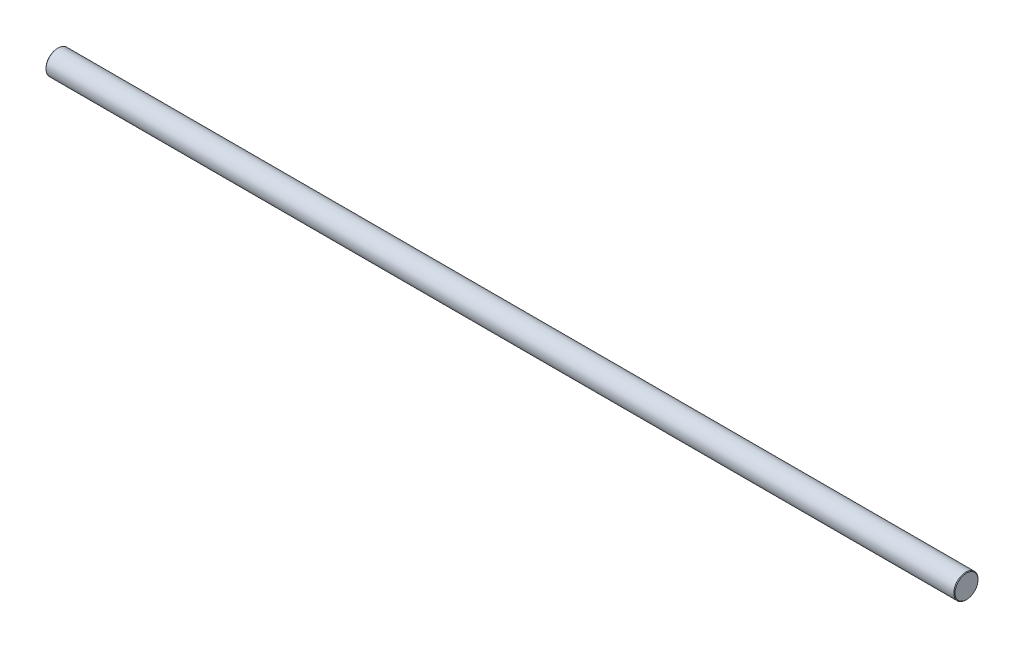
ISO-10303-21;
HEADER;
FILE_DESCRIPTION(('STEP AP214'),'2;1');
FILE_NAME('part.step','',(''),(''),'','','');
FILE_SCHEMA(('AUTOMOTIVE_DESIGN { 1 0 10303 214 1 1 1 1 }'));
ENDSEC;
DATA;
#1=APPLICATION_CONTEXT('core data for automotive mechanical design processes');
#2=APPLICATION_PROTOCOL_DEFINITION('international standard','automotive_design',2000,#1);
#3=PRODUCT_CONTEXT('',#1,'mechanical');
#4=PRODUCT('Part','Part','',(#3));
#5=PRODUCT_RELATED_PRODUCT_CATEGORY('part','',(#4));
#6=PRODUCT_DEFINITION_FORMATION('','',#4);
#7=PRODUCT_DEFINITION_CONTEXT('part definition',#1,'design');
#8=PRODUCT_DEFINITION('design','',#6,#7);
#9=PRODUCT_DEFINITION_SHAPE('','',#8);
#10=(LENGTH_UNIT() NAMED_UNIT(*) SI_UNIT(.MILLI.,.METRE.));
#11=(NAMED_UNIT(*) PLANE_ANGLE_UNIT() SI_UNIT($,.RADIAN.));
#12=(NAMED_UNIT(*) SI_UNIT($,.STERADIAN.) SOLID_ANGLE_UNIT());
#13=UNCERTAINTY_MEASURE_WITH_UNIT(LENGTH_MEASURE(1.E-05),#10,'distance_accuracy_value','');
#14=(GEOMETRIC_REPRESENTATION_CONTEXT(3) GLOBAL_UNCERTAINTY_ASSIGNED_CONTEXT((#13)) GLOBAL_UNIT_ASSIGNED_CONTEXT((#10,
#11,#12)) REPRESENTATION_CONTEXT('',''));
#15=CARTESIAN_POINT('',(0.,0.,0.));
#16=DIRECTION('',(0.,0.,1.));
#17=DIRECTION('',(1.,0.,0.));
#18=AXIS2_PLACEMENT_3D('',#15,#16,#17);
#19=CARTESIAN_POINT('',(300.,0.,0.));
#20=DIRECTION('',(-1.,0.,0.));
#21=DIRECTION('',(0.,0.,1.));
#22=AXIS2_PLACEMENT_3D('',#19,#20,#21);
#23=CYLINDRICAL_SURFACE('',#22,4.);
#24=CARTESIAN_POINT('',(0.199999999999999,0.,0.));
#25=DIRECTION('',(1.,0.,0.));
#26=DIRECTION('',(0.,0.,-1.));
#27=AXIS2_PLACEMENT_3D('',#24,#25,#26);
#28=CIRCLE('',#27,4.);
#29=CARTESIAN_POINT('',(0.199999999999999,0.,-4.));
#30=VERTEX_POINT('',#29);
#31=EDGE_CURVE('E11',#30,#30,#28,.F.);
#32=ORIENTED_EDGE('',*,*,#31,.F.);
#33=EDGE_LOOP('',(#32));
#34=FACE_BOUND('',#33,.T.);
#35=CARTESIAN_POINT('',(299.8,0.,0.));
#36=DIRECTION('',(-1.,0.,0.));
#37=DIRECTION('',(0.,0.,1.));
#38=AXIS2_PLACEMENT_3D('',#35,#36,#37);
#39=CIRCLE('',#38,4.);
#40=CARTESIAN_POINT('',(299.8,0.,4.));
#41=VERTEX_POINT('',#40);
#42=EDGE_CURVE('E48',#41,#41,#39,.F.);
#43=ORIENTED_EDGE('',*,*,#42,.F.);
#44=EDGE_LOOP('',(#43));
#45=FACE_BOUND('',#44,.T.);
#46=ADVANCED_FACE('F38',(#34,#45),#23,.T.);
#47=CARTESIAN_POINT('',(0.,0.,0.));
#48=DIRECTION('',(1.,0.,0.));
#49=DIRECTION('',(0.,0.,1.));
#50=AXIS2_PLACEMENT_3D('',#47,#48,#49);
#51=CONICAL_SURFACE('',#50,3.8,0.78539816339745);
#52=CARTESIAN_POINT('',(0.,0.,0.));
#53=DIRECTION('',(-1.,0.,0.));
#54=DIRECTION('',(0.,0.,1.));
#55=AXIS2_PLACEMENT_3D('',#52,#53,#54);
#56=CIRCLE('',#55,3.8);
#57=CARTESIAN_POINT('',(0.,0.,3.8));
#58=VERTEX_POINT('',#57);
#59=EDGE_CURVE('E44',#58,#58,#56,.T.);
#60=ORIENTED_EDGE('',*,*,#59,.F.);
#61=EDGE_LOOP('',(#60));
#62=FACE_BOUND('',#61,.T.);
#63=ORIENTED_EDGE('',*,*,#31,.T.);
#64=EDGE_LOOP('',(#63));
#65=FACE_BOUND('',#64,.T.);
#66=ADVANCED_FACE('F68',(#62,#65),#51,.T.);
#67=CARTESIAN_POINT('',(0.,0.,0.));
#68=DIRECTION('',(1.,0.,0.));
#69=DIRECTION('',(0.,0.,-1.));
#70=AXIS2_PLACEMENT_3D('',#67,#68,#69);
#71=PLANE('',#70);
#72=ORIENTED_EDGE('',*,*,#59,.T.);
#73=EDGE_LOOP('',(#72));
#74=FACE_BOUND('',#73,.T.);
#75=ADVANCED_FACE('F63',(#74),#71,.F.);
#76=CARTESIAN_POINT('',(300.,0.,0.));
#77=DIRECTION('',(-1.,0.,0.));
#78=DIRECTION('',(0.,0.,-1.));
#79=AXIS2_PLACEMENT_3D('',#76,#77,#78);
#80=CONICAL_SURFACE('',#79,3.8,0.78539816339745);
#81=CARTESIAN_POINT('',(300.,0.,0.));
#82=DIRECTION('',(1.,0.,0.));
#83=DIRECTION('',(0.,0.,-1.));
#84=AXIS2_PLACEMENT_3D('',#81,#82,#83);
#85=CIRCLE('',#84,3.8);
#86=CARTESIAN_POINT('',(300.,0.,-3.8));
#87=VERTEX_POINT('',#86);
#88=EDGE_CURVE('E52',#87,#87,#85,.T.);
#89=ORIENTED_EDGE('',*,*,#88,.F.);
#90=EDGE_LOOP('',(#89));
#91=FACE_BOUND('',#90,.T.);
#92=ORIENTED_EDGE('',*,*,#42,.T.);
#93=EDGE_LOOP('',(#92));
#94=FACE_BOUND('',#93,.T.);
#95=ADVANCED_FACE('F60',(#91,#94),#80,.T.);
#96=CARTESIAN_POINT('',(300.,0.,0.));
#97=DIRECTION('',(1.,0.,0.));
#98=DIRECTION('',(0.,0.,-1.));
#99=AXIS2_PLACEMENT_3D('',#96,#97,#98);
#100=PLANE('',#99);
#101=ORIENTED_EDGE('',*,*,#88,.T.);
#102=EDGE_LOOP('',(#101));
#103=FACE_BOUND('',#102,.T.);
#104=ADVANCED_FACE('F58',(#103),#100,.T.);
#105=CLOSED_SHELL('',(#46,#66,#75,#95,#104));
#106=MANIFOLD_SOLID_BREP('B2',#105);
#107=ADVANCED_BREP_SHAPE_REPRESENTATION('',(#18,#106),#14);
#108=SHAPE_DEFINITION_REPRESENTATION(#9,#107);
ENDSEC;
END-ISO-10303-21;
